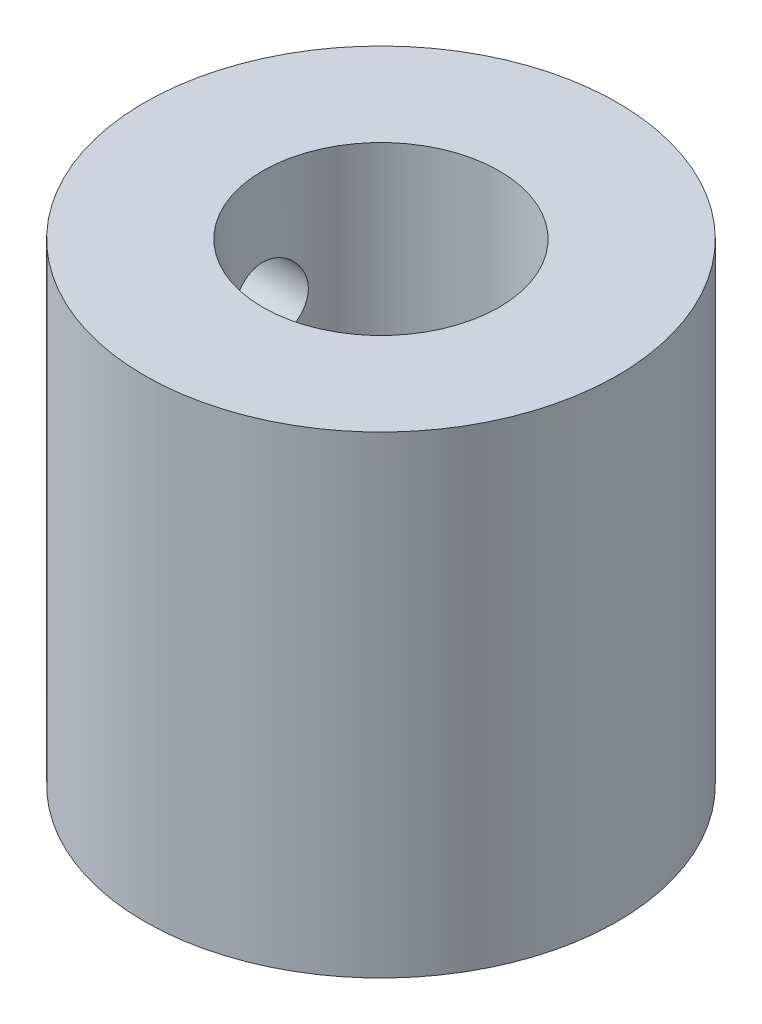
ISO-10303-21;
HEADER;
FILE_DESCRIPTION(('STEP AP214'),'2;1');
FILE_NAME('part.step','',(''),(''),'','','');
FILE_SCHEMA(('AUTOMOTIVE_DESIGN { 1 0 10303 214 1 1 1 1 }'));
ENDSEC;
DATA;
#1=APPLICATION_CONTEXT('core data for automotive mechanical design processes');
#2=APPLICATION_PROTOCOL_DEFINITION('international standard','automotive_design',2000,#1);
#3=PRODUCT_CONTEXT('',#1,'mechanical');
#4=PRODUCT('Part','Part','',(#3));
#5=PRODUCT_RELATED_PRODUCT_CATEGORY('part','',(#4));
#6=PRODUCT_DEFINITION_FORMATION('','',#4);
#7=PRODUCT_DEFINITION_CONTEXT('part definition',#1,'design');
#8=PRODUCT_DEFINITION('design','',#6,#7);
#9=PRODUCT_DEFINITION_SHAPE('','',#8);
#10=(LENGTH_UNIT() NAMED_UNIT(*) SI_UNIT(.MILLI.,.METRE.));
#11=(NAMED_UNIT(*) PLANE_ANGLE_UNIT() SI_UNIT($,.RADIAN.));
#12=(NAMED_UNIT(*) SI_UNIT($,.STERADIAN.) SOLID_ANGLE_UNIT());
#13=UNCERTAINTY_MEASURE_WITH_UNIT(LENGTH_MEASURE(1.E-05),#10,'distance_accuracy_value','');
#14=(GEOMETRIC_REPRESENTATION_CONTEXT(3) GLOBAL_UNCERTAINTY_ASSIGNED_CONTEXT((#13)) GLOBAL_UNIT_ASSIGNED_CONTEXT((#10,
#11,#12)) REPRESENTATION_CONTEXT('',''));
#15=CARTESIAN_POINT('',(0.,0.,0.));
#16=DIRECTION('',(0.,0.,1.));
#17=DIRECTION('',(1.,0.,0.));
#18=AXIS2_PLACEMENT_3D('',#15,#16,#17);
#19=CARTESIAN_POINT('',(0.,20.,0.));
#20=DIRECTION('',(0.,-1.,0.));
#21=DIRECTION('',(0.,0.,-1.));
#22=AXIS2_PLACEMENT_3D('',#19,#20,#21);
#23=CYLINDRICAL_SURFACE('',#22,4.);
#24=CARTESIAN_POINT('',(-3.64383040220041,5.,-1.65));
#25=CARTESIAN_POINT('',(-3.64383945275153,5.08809648022568,-1.64999056813102));
#26=CARTESIAN_POINT('',(-3.64707173267573,5.17634043197359,-1.64289989177358));
#27=CARTESIAN_POINT('',(-3.65959209124688,5.35028706107888,-1.61480845546373));
#28=CARTESIAN_POINT('',(-3.66889676295874,5.4359821005976,-1.5937695789634));
#29=CARTESIAN_POINT('',(-3.69231325052125,5.60200293813063,-1.53873536249638));
#30=CARTESIAN_POINT('',(-3.70640571161012,5.6823488202186,-1.50479212400174));
#31=CARTESIAN_POINT('',(-3.73778230052357,5.83618176683423,-1.42506535594207));
#32=CARTESIAN_POINT('',(-3.75506562873472,5.90967054278404,-1.37928479159595));
#33=CARTESIAN_POINT('',(-3.7920553041855,6.0522286878465,-1.27419856290372));
#34=CARTESIAN_POINT('',(-3.81184277704779,6.12082925578021,-1.2142851824136));
#35=CARTESIAN_POINT('',(-3.85094363418238,6.24735477190876,-1.08391072165483));
#36=CARTESIAN_POINT('',(-3.87025683535296,6.30527565147223,-1.01344563996365));
#37=CARTESIAN_POINT('',(-3.90721575035942,6.41117137130187,-0.860301943593384));
#38=CARTESIAN_POINT('',(-3.92475616703248,6.45862093270616,-0.777232390113593));
#39=CARTESIAN_POINT('',(-3.95520283117798,6.5386701453217,-0.603436361875859));
#40=CARTESIAN_POINT('',(-3.96811109652272,6.57127626434656,-0.512713242513047));
#41=CARTESIAN_POINT('',(-3.98726403378776,6.61902070665623,-0.3311051723044));
#42=CARTESIAN_POINT('',(-3.99381564337609,6.63496684792324,-0.240465625184494));
#43=CARTESIAN_POINT('',(-4.0006306156112,6.65154665185517,-0.0575763551498665));
#44=CARTESIAN_POINT('',(-4.00089647540932,6.65218639532201,0.0346727137709538));
#45=CARTESIAN_POINT('',(-3.99529224160632,6.63856350386341,0.212297380895984));
#46=CARTESIAN_POINT('',(-3.98978733384658,6.6251878162829,0.297754665400396));
#47=CARTESIAN_POINT('',(-3.97375926025944,6.58543118255225,0.465085845235278));
#48=CARTESIAN_POINT('',(-3.96323572489496,6.55904927870932,0.546959476205492));
#49=CARTESIAN_POINT('',(-3.93798907731603,6.49371233827982,0.706295606817229));
#50=CARTESIAN_POINT('',(-3.92320447216362,6.45457201007513,0.783671979762469));
#51=CARTESIAN_POINT('',(-3.89088763760773,6.3650087208134,0.930960489992466));
#52=CARTESIAN_POINT('',(-3.87335444442336,6.3145817994967,1.00086999453932));
#53=CARTESIAN_POINT('',(-3.83587133640027,6.19981176097137,1.13638530947041));
#54=CARTESIAN_POINT('',(-3.8158381454309,6.13474658910128,1.20135746318645));
#55=CARTESIAN_POINT('',(-3.77653142784555,5.99459033367843,1.31973838423493));
#56=CARTESIAN_POINT('',(-3.75725818494773,5.9194955507367,1.37314286572202));
#57=CARTESIAN_POINT('',(-3.72106607156909,5.75840159645269,1.46845339844828));
#58=CARTESIAN_POINT('',(-3.70424107982558,5.67213242830735,1.50994179309277));
#59=CARTESIAN_POINT('',(-3.67596385006485,5.49295332859411,1.57754508127096));
#60=CARTESIAN_POINT('',(-3.66450786071418,5.40004808612619,1.60367071206121));
#61=CARTESIAN_POINT('',(-3.64919091711418,5.21657710481502,1.63821320355941));
#62=CARTESIAN_POINT('',(-3.64489111171831,5.12624169881714,1.64765569454682));
#63=CARTESIAN_POINT('',(-3.64311980380967,4.9451943703014,1.65157101672826));
#64=CARTESIAN_POINT('',(-3.64564601607449,4.85448258394072,1.64604885780402));
#65=CARTESIAN_POINT('',(-3.65678944366161,4.68119899095053,1.62112710501826));
#66=CARTESIAN_POINT('',(-3.66501803861665,4.59847182032539,1.60261202118543));
#67=CARTESIAN_POINT('',(-3.68614612916707,4.43736293562003,1.55339580262015));
#68=CARTESIAN_POINT('',(-3.69904670212356,4.35898222864834,1.52269185697123));
#69=CARTESIAN_POINT('',(-3.72872477858182,4.20512099430436,1.44853902204985));
#70=CARTESIAN_POINT('',(-3.74564214050945,4.12989980522075,1.40460979308264));
#71=CARTESIAN_POINT('',(-3.78124523189864,3.98753983057027,1.30573455409451));
#72=CARTESIAN_POINT('',(-3.79993171387674,3.92040451226488,1.25078384473683));
#73=CARTESIAN_POINT('',(-3.83876011670653,3.79057037355329,1.12627542162098));
#74=CARTESIAN_POINT('',(-3.85889967217623,3.72864826295128,1.05590387126704));
#75=CARTESIAN_POINT('',(-3.89698114804694,3.61735714433793,0.905297980080104));
#76=CARTESIAN_POINT('',(-3.91492292631236,3.5679889479968,0.825063002026904));
#77=CARTESIAN_POINT('',(-3.94668767391886,3.48329586579321,0.656516816883267));
#78=CARTESIAN_POINT('',(-3.96050313975064,3.44799652499727,0.568191273870491));
#79=CARTESIAN_POINT('',(-3.98237104121022,3.39300834314125,0.386140833605177));
#80=CARTESIAN_POINT('',(-3.9904268305481,3.37331041706106,0.29241911281756));
#81=CARTESIAN_POINT('',(-3.9994889299446,3.35121177107952,0.109187189544835));
#82=CARTESIAN_POINT('',(-4.00094173424749,3.34771517125806,0.0198303081186347));
#83=CARTESIAN_POINT('',(-3.99786220239438,3.35518543437028,-0.158161739195413));
#84=CARTESIAN_POINT('',(-3.99333087896147,3.36614984999545,-0.246797024648481));
#85=CARTESIAN_POINT('',(-3.979024148364,3.40144464213556,-0.417705375935877));
#86=CARTESIAN_POINT('',(-3.96943363922013,3.42530444211455,-0.500092371627852));
#87=CARTESIAN_POINT('',(-3.94605480923816,3.48520411487999,-0.659667355734161));
#88=CARTESIAN_POINT('',(-3.93226568297162,3.52124632478668,-0.736854343148745));
#89=CARTESIAN_POINT('',(-3.90105808483759,3.60630452668639,-0.88766113373262));
#90=CARTESIAN_POINT('',(-3.88350423911689,3.65583125677293,-0.960964214361151));
#91=CARTESIAN_POINT('',(-3.84685709666619,3.76570284679,-1.09852932170705));
#92=CARTESIAN_POINT('',(-3.82776324400832,3.82605162308081,-1.1627880603165));
#93=CARTESIAN_POINT('',(-3.78859741195738,3.96058752735466,-1.28487769945047));
#94=CARTESIAN_POINT('',(-3.76854475207571,4.03542775688494,-1.34199767947157));
#95=CARTESIAN_POINT('',(-3.73105419200533,4.19426597568106,-1.4429647467733));
#96=CARTESIAN_POINT('',(-3.7136177396712,4.27826899170959,-1.48680449811904));
#97=CARTESIAN_POINT('',(-3.68370387904713,4.45272844126989,-1.55944447766652));
#98=CARTESIAN_POINT('',(-3.67119480418033,4.5431391080911,-1.58834112875234));
#99=CARTESIAN_POINT('',(-3.65281837075147,4.72804714407836,-1.63017263567573));
#100=CARTESIAN_POINT('',(-3.64692873900432,4.82252969087687,-1.64316103312975));
#101=CARTESIAN_POINT('',(-3.64414054419779,4.94486331364264,-1.6493120932942));
#102=CARTESIAN_POINT('',(-3.64382756923722,4.97242443228502,-1.6500029523216));
#103=CARTESIAN_POINT('',(-3.64383040220041,5.,-1.65));
#104=B_SPLINE_CURVE_WITH_KNOTS('',3,(#24,#25,#26,#27,#28,#29,#30,#31,#32,#33,#34,#35,#36,#37,
#38,#39,#40,#41,#42,#43,#44,#45,#46,#47,#48,#49,#50,#51,#52,#53,#54,#55,#56,#57,#58,#59,#60,#61,
#62,#63,#64,#65,#66,#67,#68,#69,#70,#71,#72,#73,#74,#75,#76,#77,#78,#79,#80,#81,#82,#83,#84,#85,
#86,#87,#88,#89,#90,#91,#92,#93,#94,#95,#96,#97,#98,#99,#100,#101,#102,#103),.UNSPECIFIED.,.T.,
.F.,(4,2,2,2,2,2,2,2,2,2,2,2,2,2,2,2,2,2,2,2,2,2,2,2,2,2,2,2,2,2,2,2,2,2,2,2,2,2,2,4),(0.,
0.264211724660745,0.529148459018598,0.79302667787205,1.05683885985756,1.33523297260792,
1.6137329267621,1.90403076094908,2.19420198072699,2.4695381624427,2.74476495901024,
3.00356896819766,3.26239203686791,3.5251552692474,3.78801084539546,4.06907613148065,
4.35024537535725,4.64031806272423,4.93018777241111,5.20152035698263,5.47276211576043,
5.72713321026166,5.98156300028881,6.24665916965709,6.51186861189124,6.79815687284347,
7.08446363898863,7.37128791456171,7.65794504349151,7.92489841526079,8.19180661499935,
8.44957452423759,8.70739191275388,8.97680852354695,9.24632283025307,9.53374725602176,
9.82133016535516,10.1070334851925,10.3917725616094,10.4744749384332),.UNSPECIFIED.);
#105=CARTESIAN_POINT('',(-3.64383040220041,5.,-1.65));
#106=VERTEX_POINT('',#105);
#107=EDGE_CURVE('E98',#106,#106,#104,.T.);
#108=ORIENTED_EDGE('',*,*,#107,.F.);
#109=EDGE_LOOP('',(#108));
#110=FACE_BOUND('',#109,.T.);
#111=CARTESIAN_POINT('',(0.,0.,0.));
#112=DIRECTION('',(0.,1.,0.));
#113=DIRECTION('',(0.,0.,1.));
#114=AXIS2_PLACEMENT_3D('',#111,#112,#113);
#115=CIRCLE('',#114,4.);
#116=CARTESIAN_POINT('',(0.,0.,4.));
#117=VERTEX_POINT('',#116);
#118=EDGE_CURVE('E61',#117,#117,#115,.T.);
#119=ORIENTED_EDGE('',*,*,#118,.F.);
#120=EDGE_LOOP('',(#119));
#121=FACE_BOUND('',#120,.T.);
#122=CARTESIAN_POINT('',(0.,10.,0.));
#123=DIRECTION('',(0.,1.,0.));
#124=DIRECTION('',(0.,0.,1.));
#125=AXIS2_PLACEMENT_3D('',#122,#123,#124);
#126=CIRCLE('',#125,4.);
#127=CARTESIAN_POINT('',(0.,10.,4.));
#128=VERTEX_POINT('',#127);
#129=EDGE_CURVE('E66',#128,#128,#126,.T.);
#130=ORIENTED_EDGE('',*,*,#129,.T.);
#131=EDGE_LOOP('',(#130));
#132=FACE_BOUND('',#131,.T.);
#133=ADVANCED_FACE('F37',(#110,#121,#132),#23,.F.);
#134=CARTESIAN_POINT('',(0.,20.,0.));
#135=DIRECTION('',(0.,1.,0.));
#136=DIRECTION('',(0.,0.,1.));
#137=AXIS2_PLACEMENT_3D('',#134,#135,#136);
#138=PLANE('',#137);
#139=CARTESIAN_POINT('',(0.,20.,0.));
#140=DIRECTION('',(0.,1.,0.));
#141=DIRECTION('',(0.,0.,1.));
#142=AXIS2_PLACEMENT_3D('',#139,#140,#141);
#143=CIRCLE('',#142,5.);
#144=CARTESIAN_POINT('',(0.,20.,5.));
#145=VERTEX_POINT('',#144);
#146=EDGE_CURVE('E105',#145,#145,#143,.T.);
#147=ORIENTED_EDGE('',*,*,#146,.F.);
#148=EDGE_LOOP('',(#147));
#149=FACE_BOUND('',#148,.T.);
#150=CARTESIAN_POINT('',(0.,20.,0.));
#151=DIRECTION('',(0.,1.,0.));
#152=DIRECTION('',(0.,0.,1.));
#153=AXIS2_PLACEMENT_3D('',#150,#151,#152);
#154=CIRCLE('',#153,10.);
#155=CARTESIAN_POINT('',(0.,20.,10.));
#156=VERTEX_POINT('',#155);
#157=EDGE_CURVE('E50',#156,#156,#154,.T.);
#158=ORIENTED_EDGE('',*,*,#157,.T.);
#159=EDGE_LOOP('',(#158));
#160=FACE_BOUND('',#159,.T.);
#161=ADVANCED_FACE('F109',(#149,#160),#138,.T.);
#162=CARTESIAN_POINT('',(0.,0.,0.));
#163=DIRECTION('',(0.,1.,0.));
#164=DIRECTION('',(0.,0.,1.));
#165=AXIS2_PLACEMENT_3D('',#162,#163,#164);
#166=PLANE('',#165);
#167=CARTESIAN_POINT('',(0.,0.,0.));
#168=DIRECTION('',(0.,1.,0.));
#169=DIRECTION('',(0.,0.,1.));
#170=AXIS2_PLACEMENT_3D('',#167,#168,#169);
#171=CIRCLE('',#170,10.);
#172=CARTESIAN_POINT('',(0.,0.,10.));
#173=VERTEX_POINT('',#172);
#174=EDGE_CURVE('E55',#173,#173,#171,.T.);
#175=ORIENTED_EDGE('',*,*,#174,.F.);
#176=EDGE_LOOP('',(#175));
#177=FACE_BOUND('',#176,.T.);
#178=ORIENTED_EDGE('',*,*,#118,.T.);
#179=EDGE_LOOP('',(#178));
#180=FACE_BOUND('',#179,.T.);
#181=ADVANCED_FACE('F112',(#177,#180),#166,.F.);
#182=CARTESIAN_POINT('',(0.,20.,0.));
#183=DIRECTION('',(0.,-1.,0.));
#184=DIRECTION('',(0.,0.,-1.));
#185=AXIS2_PLACEMENT_3D('',#182,#183,#184);
#186=CYLINDRICAL_SURFACE('',#185,10.);
#187=CARTESIAN_POINT('',(-10.,3.35,0.));
#188=CARTESIAN_POINT('',(-9.99999843258099,3.35000370098531,-0.0920114531057516));
#189=CARTESIAN_POINT('',(-9.99871684765511,3.35772245868542,-0.184073454347173));
#190=CARTESIAN_POINT('',(-9.99372775496381,3.38838123513793,-0.36561632253533));
#191=CARTESIAN_POINT('',(-9.99001800272159,3.4113353369588,-0.45509472135177));
#192=CARTESIAN_POINT('',(-9.98058875631552,3.47175363893591,-0.628817487751616));
#193=CARTESIAN_POINT('',(-9.974870893487,3.5092060635603,-0.713066038744487));
#194=CARTESIAN_POINT('',(-9.96205444853338,3.59752725414862,-0.874072236504044));
#195=CARTESIAN_POINT('',(-9.95495602786423,3.64839445150501,-0.950830757653331));
#196=CARTESIAN_POINT('',(-9.9400912001718,3.76260877713292,-1.09540879372213));
#197=CARTESIAN_POINT('',(-9.93231968689365,3.82605706361825,-1.1631478788234));
#198=CARTESIAN_POINT('',(-9.91702374723339,3.96341477359322,-1.28706950777735));
#199=CARTESIAN_POINT('',(-9.90949933632427,4.03732485064318,-1.34325132909589));
#200=CARTESIAN_POINT('',(-9.89550007731641,4.19405934367668,-1.44278500045254));
#201=CARTESIAN_POINT('',(-9.88903182722124,4.27693479434388,-1.48605749570899));
#202=CARTESIAN_POINT('',(-9.87794796970923,4.44890262523649,-1.55803674048925));
#203=CARTESIAN_POINT('',(-9.87333223970889,4.53799459364928,-1.58674445381556));
#204=CARTESIAN_POINT('',(-9.86652679242373,4.71901458200099,-1.6285261950301));
#205=CARTESIAN_POINT('',(-9.86431555933323,4.81090975567876,-1.64173895927951));
#206=CARTESIAN_POINT('',(-9.86250435770823,4.99563736592343,-1.65258585530687));
#207=CARTESIAN_POINT('',(-9.86290420804218,5.08846973703063,-1.6502210677036));
#208=CARTESIAN_POINT('',(-9.86625034802632,5.27144727705671,-1.63009303176278));
#209=CARTESIAN_POINT('',(-9.86917088684506,5.36161011402737,-1.61248549472488));
#210=CARTESIAN_POINT('',(-9.87718903199043,5.5376840705334,-1.5626160736781));
#211=CARTESIAN_POINT('',(-9.88228671162733,5.62359504678828,-1.53035369619839));
#212=CARTESIAN_POINT('',(-9.89411264039674,5.78919352992442,-1.45193210975572));
#213=CARTESIAN_POINT('',(-9.90084846298694,5.86884978924069,-1.40570810605851));
#214=CARTESIAN_POINT('',(-9.9151864393107,6.01933432390775,-1.30072141548378));
#215=CARTESIAN_POINT('',(-9.92278866158316,6.09016189991229,-1.24195773629987));
#216=CARTESIAN_POINT('',(-9.93811607123993,6.22187997888267,-1.11271072676603));
#217=CARTESIAN_POINT('',(-9.94584163094155,6.28263939462996,-1.04209376928223));
#218=CARTESIAN_POINT('',(-9.96045987838133,6.39146602160627,-0.891597059898569));
#219=CARTESIAN_POINT('',(-9.9673525609492,6.43953315404709,-0.811717250503361));
#220=CARTESIAN_POINT('',(-9.97953794169528,6.52162215053432,-0.644840083170757));
#221=CARTESIAN_POINT('',(-9.98482933722619,6.55563258763802,-0.557837003156563));
#222=CARTESIAN_POINT('',(-9.99320544362233,6.60852191277534,-0.379246930002474));
#223=CARTESIAN_POINT('',(-9.99629033536768,6.62740204114479,-0.287660313260825));
#224=CARTESIAN_POINT('',(-9.99988156603306,6.64931746116117,-0.103632983819164));
#225=CARTESIAN_POINT('',(-10.0004171933872,6.65253273612154,-0.0112142564118387));
#226=CARTESIAN_POINT('',(-9.99892971175882,6.64350680131974,0.172841505554678));
#227=CARTESIAN_POINT('',(-9.99690669920295,6.63126617403953,0.264478569441161));
#228=CARTESIAN_POINT('',(-9.99054737820398,6.5918255972229,0.443814955541767));
#229=CARTESIAN_POINT('',(-9.98622483070292,6.56471460569165,0.531534371938299));
#230=CARTESIAN_POINT('',(-9.97574921956607,6.49639760744493,0.70118295929459));
#231=CARTESIAN_POINT('',(-9.96959605484327,6.45519082233832,0.783111810188987));
#232=CARTESIAN_POINT('',(-9.95606928426946,6.35943868050102,0.93963639887725));
#233=CARTESIAN_POINT('',(-9.94868555427359,6.3047807140829,1.01416235726447));
#234=CARTESIAN_POINT('',(-9.93354765732487,6.18383285093121,1.15304841333208));
#235=CARTESIAN_POINT('',(-9.92579346406183,6.11754212714571,1.21740778758216));
#236=CARTESIAN_POINT('',(-9.91069407401676,5.97440389367171,1.33479962911472));
#237=CARTESIAN_POINT('',(-9.90335382329475,5.89745612890119,1.38771058951943));
#238=CARTESIAN_POINT('',(-9.89000528724129,5.73565895293254,1.47985547415617));
#239=CARTESIAN_POINT('',(-9.88399696030451,5.6508097886681,1.51908982562647));
#240=CARTESIAN_POINT('',(-9.87402953570153,5.47596046759685,1.58258535747086));
#241=CARTESIAN_POINT('',(-9.87006212213643,5.38598290020333,1.60690737863649));
#242=CARTESIAN_POINT('',(-9.86460473721113,5.20314868821944,1.64007952798876));
#243=CARTESIAN_POINT('',(-9.86311455516768,5.11029228915184,1.64893097191818));
#244=CARTESIAN_POINT('',(-9.86278931217107,4.92554935869819,1.65087457438795));
#245=CARTESIAN_POINT('',(-9.86392203182987,4.83366483980789,1.64415796786954));
#246=CARTESIAN_POINT('',(-9.86864441177183,4.65235224813613,1.61556925478547));
#247=CARTESIAN_POINT('',(-9.87223406454433,4.56292416784641,1.59369719454886));
#248=CARTESIAN_POINT('',(-9.88145370519205,4.38913475756459,1.53549112071356));
#249=CARTESIAN_POINT('',(-9.88708141498759,4.30476789254903,1.49917324977366));
#250=CARTESIAN_POINT('',(-9.8997453323177,4.14329373313968,1.41312606218935));
#251=CARTESIAN_POINT('',(-9.90678160742252,4.06618678727227,1.36339610211421));
#252=CARTESIAN_POINT('',(-9.92157214136343,3.92045450236231,1.25125259966706));
#253=CARTESIAN_POINT('',(-9.92933379899765,3.85193824018043,1.18869826623127));
#254=CARTESIAN_POINT('',(-9.94464125601211,3.72630940012324,1.05297867490409));
#255=CARTESIAN_POINT('',(-9.95218700513286,3.66919945921976,0.979810970092672));
#256=CARTESIAN_POINT('',(-9.96627143049842,3.56765257742652,0.824354696103047));
#257=CARTESIAN_POINT('',(-9.97280295936929,3.52330385202197,0.742007852048188));
#258=CARTESIAN_POINT('',(-9.98405342047581,3.44913664719369,0.570959586923796));
#259=CARTESIAN_POINT('',(-9.98877416450827,3.41930363587476,0.482264623543764));
#260=CARTESIAN_POINT('',(-9.99483601455804,3.38152065847315,0.327682758240929));
#261=CARTESIAN_POINT('',(-9.99676220083327,3.3697192511855,0.2627330667111));
#262=CARTESIAN_POINT('',(-9.99934474465587,3.35395766106689,0.131864227625941));
#263=CARTESIAN_POINT('',(-10.0000011233775,3.34999734748421,0.065945096254669));
#264=CARTESIAN_POINT('',(-10.,3.35,0.));
#265=B_SPLINE_CURVE_WITH_KNOTS('',3,(#187,#188,#189,#190,#191,#192,#193,#194,#195,#196,#197,
#198,#199,#200,#201,#202,#203,#204,#205,#206,#207,#208,#209,#210,#211,#212,#213,#214,#215,#216,
#217,#218,#219,#220,#221,#222,#223,#224,#225,#226,#227,#228,#229,#230,#231,#232,#233,#234,#235,
#236,#237,#238,#239,#240,#241,#242,#243,#244,#245,#246,#247,#248,#249,#250,#251,#252,#253,#254,
#255,#256,#257,#258,#259,#260,#261,#262,#263,#264),.UNSPECIFIED.,.T.,.F.,(4,2,2,2,2,2,2,2,2,2,2,
2,2,2,2,2,2,2,2,2,2,2,2,2,2,2,2,2,2,2,2,2,2,2,2,2,2,2,4),(0.,0.275793319008919,
0.551841928312974,0.827666799870601,1.10345943314171,1.38156673144316,1.65969141110742,
1.93949209608634,2.21927426326045,2.49653175525207,2.7737700140227,3.04820914252878,
3.32265751287873,3.59839967320043,3.87416366201708,4.15327572401922,4.43238951858749,
4.71172976565334,4.99104711092803,5.26714751096619,5.54323750600192,5.81769359979006,
6.09216485190806,6.36901711215388,6.6458890636926,6.92556925596461,7.2052407106323,
7.48376340648036,7.76226241335699,8.03735855216248,8.31245385002405,8.58724259883662,
8.8620445326932,9.14004258759621,9.41810483731135,9.69804546871321,9.97770526783285,
10.1753710978728,10.3730336317699),.UNSPECIFIED.);
#266=CARTESIAN_POINT('',(-10.,3.35,0.));
#267=VERTEX_POINT('',#266);
#268=EDGE_CURVE('E10',#267,#267,#265,.T.);
#269=ORIENTED_EDGE('',*,*,#268,.T.);
#270=EDGE_LOOP('',(#269));
#271=FACE_BOUND('',#270,.T.);
#272=CARTESIAN_POINT('',(-10.,13.35,0.));
#273=CARTESIAN_POINT('',(-9.99999843258099,13.3500037009853,-0.0920114531057514));
#274=CARTESIAN_POINT('',(-9.99871684765511,13.3577224586854,-0.184073454347173));
#275=CARTESIAN_POINT('',(-9.99372775496381,13.3883812351379,-0.36561632253533));
#276=CARTESIAN_POINT('',(-9.99001800272159,13.4113353369588,-0.45509472135177));
#277=CARTESIAN_POINT('',(-9.98058875631552,13.4717536389359,-0.628817487751616));
#278=CARTESIAN_POINT('',(-9.974870893487,13.5092060635603,-0.713066038744486));
#279=CARTESIAN_POINT('',(-9.96205444853338,13.5975272541486,-0.874072236504043));
#280=CARTESIAN_POINT('',(-9.95495602786423,13.648394451505,-0.95083075765333));
#281=CARTESIAN_POINT('',(-9.9400912001718,13.7626087771329,-1.09540879372213));
#282=CARTESIAN_POINT('',(-9.93231968689365,13.8260570636182,-1.16314787882339));
#283=CARTESIAN_POINT('',(-9.91702374723339,13.9634147735932,-1.28706950777735));
#284=CARTESIAN_POINT('',(-9.90949933632427,14.0373248506432,-1.34325132909589));
#285=CARTESIAN_POINT('',(-9.89550007731641,14.1940593436767,-1.44278500045254));
#286=CARTESIAN_POINT('',(-9.88903182722124,14.2769347943439,-1.48605749570899));
#287=CARTESIAN_POINT('',(-9.87794796970923,14.4489026252365,-1.55803674048925));
#288=CARTESIAN_POINT('',(-9.87333223970889,14.5379945936493,-1.58674445381556));
#289=CARTESIAN_POINT('',(-9.86652679242373,14.719014582001,-1.6285261950301));
#290=CARTESIAN_POINT('',(-9.86431555933323,14.8109097556788,-1.64173895927951));
#291=CARTESIAN_POINT('',(-9.86250435770823,14.9956373659234,-1.65258585530687));
#292=CARTESIAN_POINT('',(-9.86290420804218,15.0884697370306,-1.6502210677036));
#293=CARTESIAN_POINT('',(-9.86625034802632,15.2714472770567,-1.63009303176278));
#294=CARTESIAN_POINT('',(-9.86917088684506,15.3616101140274,-1.61248549472488));
#295=CARTESIAN_POINT('',(-9.87718903199043,15.5376840705334,-1.5626160736781));
#296=CARTESIAN_POINT('',(-9.88228671162733,15.6235950467883,-1.53035369619838));
#297=CARTESIAN_POINT('',(-9.89411264039674,15.7891935299244,-1.45193210975571));
#298=CARTESIAN_POINT('',(-9.90084846298694,15.8688497892407,-1.4057081060585));
#299=CARTESIAN_POINT('',(-9.9151864393107,16.0193343239078,-1.30072141548378));
#300=CARTESIAN_POINT('',(-9.92278866158316,16.0901618999123,-1.24195773629987));
#301=CARTESIAN_POINT('',(-9.93811607123993,16.2218799788827,-1.11271072676603));
#302=CARTESIAN_POINT('',(-9.94584163094155,16.28263939463,-1.04209376928223));
#303=CARTESIAN_POINT('',(-9.96045987838133,16.3914660216063,-0.891597059898569));
#304=CARTESIAN_POINT('',(-9.9673525609492,16.4395331540471,-0.811717250503361));
#305=CARTESIAN_POINT('',(-9.97953794169528,16.5216221505343,-0.644840083170756));
#306=CARTESIAN_POINT('',(-9.98482933722619,16.555632587638,-0.557837003156562));
#307=CARTESIAN_POINT('',(-9.99320544362233,16.6085219127753,-0.379246930002473));
#308=CARTESIAN_POINT('',(-9.99629033536768,16.6274020411448,-0.287660313260824));
#309=CARTESIAN_POINT('',(-9.99988156603306,16.6493174611612,-0.103632983819163));
#310=CARTESIAN_POINT('',(-10.0004171933872,16.6525327361215,-0.0112142564118374));
#311=CARTESIAN_POINT('',(-9.99892971175882,16.6435068013197,0.17284150555468));
#312=CARTESIAN_POINT('',(-9.99690669920295,16.6312661740395,0.264478569441163));
#313=CARTESIAN_POINT('',(-9.99054737820398,16.5918255972229,0.443814955541769));
#314=CARTESIAN_POINT('',(-9.98622483070291,16.5647146056916,0.531534371938301));
#315=CARTESIAN_POINT('',(-9.97574921956607,16.4963976074449,0.701182959294593));
#316=CARTESIAN_POINT('',(-9.96959605484327,16.4551908223383,0.78311181018899));
#317=CARTESIAN_POINT('',(-9.95606928426946,16.359438680501,0.939636398877252));
#318=CARTESIAN_POINT('',(-9.94868555427359,16.3047807140829,1.01416235726447));
#319=CARTESIAN_POINT('',(-9.93354765732487,16.1838328509312,1.15304841333209));
#320=CARTESIAN_POINT('',(-9.92579346406183,16.1175421271457,1.21740778758216));
#321=CARTESIAN_POINT('',(-9.91069407401676,15.9744038936717,1.33479962911472));
#322=CARTESIAN_POINT('',(-9.90335382329475,15.8974561289012,1.38771058951943));
#323=CARTESIAN_POINT('',(-9.89000528724129,15.7356589529325,1.47985547415617));
#324=CARTESIAN_POINT('',(-9.88399696030451,15.6508097886681,1.51908982562647));
#325=CARTESIAN_POINT('',(-9.87402953570153,15.4759604675969,1.58258535747086));
#326=CARTESIAN_POINT('',(-9.87006212213643,15.3859829002033,1.60690737863649));
#327=CARTESIAN_POINT('',(-9.86460473721113,15.2031486882194,1.64007952798876));
#328=CARTESIAN_POINT('',(-9.86311455516768,15.1102922891518,1.64893097191818));
#329=CARTESIAN_POINT('',(-9.86278931217107,14.9255493586982,1.65087457438795));
#330=CARTESIAN_POINT('',(-9.86392203182987,14.8336648398079,1.64415796786954));
#331=CARTESIAN_POINT('',(-9.86864441177183,14.6523522481361,1.61556925478547));
#332=CARTESIAN_POINT('',(-9.87223406454433,14.5629241678464,1.59369719454886));
#333=CARTESIAN_POINT('',(-9.88145370519205,14.3891347575646,1.53549112071357));
#334=CARTESIAN_POINT('',(-9.88708141498759,14.304767892549,1.49917324977366));
#335=CARTESIAN_POINT('',(-9.8997453323177,14.1432937331397,1.41312606218935));
#336=CARTESIAN_POINT('',(-9.90678160742252,14.0661867872723,1.36339610211421));
#337=CARTESIAN_POINT('',(-9.92157214136343,13.9204545023623,1.25125259966706));
#338=CARTESIAN_POINT('',(-9.92933379899765,13.8519382401804,1.18869826623127));
#339=CARTESIAN_POINT('',(-9.94464125601211,13.7263094001232,1.05297867490409));
#340=CARTESIAN_POINT('',(-9.95218700513286,13.6691994592198,0.979810970092673));
#341=CARTESIAN_POINT('',(-9.96627143049842,13.5676525774265,0.824354696103048));
#342=CARTESIAN_POINT('',(-9.97280295936929,13.523303852022,0.742007852048189));
#343=CARTESIAN_POINT('',(-9.98405342047581,13.4491366471937,0.570959586923797));
#344=CARTESIAN_POINT('',(-9.98877416450827,13.4193036358748,0.482264623543765));
#345=CARTESIAN_POINT('',(-9.99483601455804,13.3815206584732,0.32768275824093));
#346=CARTESIAN_POINT('',(-9.99676220083327,13.3697192511855,0.262733066711102));
#347=CARTESIAN_POINT('',(-9.99934474465587,13.3539576610669,0.131864227625942));
#348=CARTESIAN_POINT('',(-10.0000011233775,13.3499973474842,0.0659450962546694));
#349=CARTESIAN_POINT('',(-10.,13.35,0.));
#350=B_SPLINE_CURVE_WITH_KNOTS('',3,(#272,#273,#274,#275,#276,#277,#278,#279,#280,#281,#282,
#283,#284,#285,#286,#287,#288,#289,#290,#291,#292,#293,#294,#295,#296,#297,#298,#299,#300,#301,
#302,#303,#304,#305,#306,#307,#308,#309,#310,#311,#312,#313,#314,#315,#316,#317,#318,#319,#320,
#321,#322,#323,#324,#325,#326,#327,#328,#329,#330,#331,#332,#333,#334,#335,#336,#337,#338,#339,
#340,#341,#342,#343,#344,#345,#346,#347,#348,#349),.UNSPECIFIED.,.T.,.F.,(4,2,2,2,2,2,2,2,2,2,2,
2,2,2,2,2,2,2,2,2,2,2,2,2,2,2,2,2,2,2,2,2,2,2,2,2,2,2,4),(0.,0.275793319008919,
0.551841928312974,0.8276667998706,1.10345943314171,1.38156673144316,1.65969141110742,
1.93949209608634,2.21927426326045,2.49653175525207,2.7737700140227,3.04820914252878,
3.32265751287873,3.59839967320044,3.87416366201708,4.15327572401922,4.43238951858749,
4.71172976565334,4.99104711092802,5.26714751096619,5.54323750600191,5.81769359979006,
6.09216485190805,6.36901711215388,6.6458890636926,6.92556925596461,7.2052407106323,
7.48376340648035,7.76226241335699,8.03735855216248,8.31245385002405,8.58724259883662,
8.86204453269319,9.1400425875962,9.41810483731135,9.69804546871321,9.97770526783285,
10.1753710978728,10.3730336317699),.UNSPECIFIED.);
#351=CARTESIAN_POINT('',(-10.,13.35,0.));
#352=VERTEX_POINT('',#351);
#353=EDGE_CURVE('E78',#352,#352,#350,.T.);
#354=ORIENTED_EDGE('',*,*,#353,.T.);
#355=EDGE_LOOP('',(#354));
#356=FACE_BOUND('',#355,.T.);
#357=ORIENTED_EDGE('',*,*,#157,.F.);
#358=EDGE_LOOP('',(#357));
#359=FACE_BOUND('',#358,.T.);
#360=ORIENTED_EDGE('',*,*,#174,.T.);
#361=EDGE_LOOP('',(#360));
#362=FACE_BOUND('',#361,.T.);
#363=ADVANCED_FACE('F39',(#271,#356,#359,#362),#186,.T.);
#364=CARTESIAN_POINT('',(0.,10.,0.));
#365=DIRECTION('',(0.,1.,0.));
#366=DIRECTION('',(0.,0.,1.));
#367=AXIS2_PLACEMENT_3D('',#364,#365,#366);
#368=CYLINDRICAL_SURFACE('',#367,5.);
#369=CARTESIAN_POINT('',(-4.71990466005406,15.,-1.65));
#370=CARTESIAN_POINT('',(-4.71990452115883,14.9100706007094,-1.65000024360504));
#371=CARTESIAN_POINT('',(-4.72250292266519,14.8201423135003,-1.64262303818655));
#372=CARTESIAN_POINT('',(-4.73256311651638,14.6429463265648,-1.61340616817484));
#373=CARTESIAN_POINT('',(-4.74002579119602,14.5556791125396,-1.5915638797359));
#374=CARTESIAN_POINT('',(-4.75887919770346,14.3864003006209,-1.53426465819808));
#375=CARTESIAN_POINT('',(-4.77026235105614,14.3043789223365,-1.49883397722407));
#376=CARTESIAN_POINT('',(-4.79566317693293,14.1474185036429,-1.41545303535855));
#377=CARTESIAN_POINT('',(-4.80968141232602,14.0724809815363,-1.36750009878647));
#378=CARTESIAN_POINT('',(-4.83937566103107,13.9289423606118,-1.25846654308765));
#379=CARTESIAN_POINT('',(-4.85509238793419,13.8606525142665,-1.1969871597991));
#380=CARTESIAN_POINT('',(-4.88606822622471,13.7351407323211,-1.06349727663172));
#381=CARTESIAN_POINT('',(-4.90132726544298,13.677920534534,-0.991485126335477));
#382=CARTESIAN_POINT('',(-4.93013890958224,13.5747664109772,-0.8367042156024));
#383=CARTESIAN_POINT('',(-4.94363804307574,13.5291576935933,-0.753707887278363));
#384=CARTESIAN_POINT('',(-4.9669298740668,13.4526712651502,-0.580699685040885));
#385=CARTESIAN_POINT('',(-4.97672354920831,13.4217896679435,-0.490689669179504));
#386=CARTESIAN_POINT('',(-4.99121262924257,13.3766869281248,-0.309471831071058));
#387=CARTESIAN_POINT('',(-4.99607073696453,13.3619327850115,-0.218409916306844));
#388=CARTESIAN_POINT('',(-5.00071837425094,13.3478100012852,-0.0349820134684148));
#389=CARTESIAN_POINT('',(-5.00050918484354,13.3484374721539,0.0573836391159489));
#390=CARTESIAN_POINT('',(-4.99515654976729,13.3647199745431,0.237027933093927));
#391=CARTESIAN_POINT('',(-4.99020313675408,13.3797962649372,0.324365615952691));
#392=CARTESIAN_POINT('',(-4.9761564157389,13.4235926031857,0.495193577669013));
#393=CARTESIAN_POINT('',(-4.96706282865059,13.4523135708243,0.578683596740285));
#394=CARTESIAN_POINT('',(-4.94551338736031,13.5229273780642,0.740723104693065));
#395=CARTESIAN_POINT('',(-4.93301533884174,13.5649866842574,0.819194207586599));
#396=CARTESIAN_POINT('',(-4.90596050876768,13.6609466750387,0.968137400016382));
#397=CARTESIAN_POINT('',(-4.89140316323876,13.7148506057233,1.03860728872218));
#398=CARTESIAN_POINT('',(-4.86097294536879,13.8358951764672,1.1729917525873));
#399=CARTESIAN_POINT('',(-4.84507036749807,13.9035323057344,1.23645304594368));
#400=CARTESIAN_POINT('',(-4.81431124792123,14.0486265896356,1.35127700383062));
#401=CARTESIAN_POINT('',(-4.79945486104327,14.1260851930411,1.4026378802203));
#402=CARTESIAN_POINT('',(-4.77230967313122,14.2900343988576,1.49241382326108));
#403=CARTESIAN_POINT('',(-4.76005891661914,14.3766343876614,1.5306415054313));
#404=CARTESIAN_POINT('',(-4.73995346804782,14.5555476071575,1.59181981773764));
#405=CARTESIAN_POINT('',(-4.73209697762928,14.6478584834583,1.61477669819906));
#406=CARTESIAN_POINT('',(-4.72207527963097,14.8311901676993,1.64384682592321));
#407=CARTESIAN_POINT('',(-4.71967327795615,14.9220868443492,1.6506614560171));
#408=CARTESIAN_POINT('',(-4.7201713665852,15.1037378478879,1.64923749492087));
#409=CARTESIAN_POINT('',(-4.72307051828914,15.1944921971292,1.64100156851918));
#410=CARTESIAN_POINT('',(-4.73360855675225,15.3701200722367,1.61033997123775));
#411=CARTESIAN_POINT('',(-4.74108573426459,15.4550887693968,1.58839792719591));
#412=CARTESIAN_POINT('',(-4.75976051805482,15.6201226070167,1.53152522846697));
#413=CARTESIAN_POINT('',(-4.77095877549974,15.7001868863261,1.49659230032422));
#414=CARTESIAN_POINT('',(-4.79624726899171,15.8559100270408,1.41348842564755));
#415=CARTESIAN_POINT('',(-4.81041691149476,15.9313531690256,1.36493806698655));
#416=CARTESIAN_POINT('',(-4.83989585604412,16.0732756037467,1.25640957990473));
#417=CARTESIAN_POINT('',(-4.85520548680903,16.1397522953269,1.19642814746825));
#418=CARTESIAN_POINT('',(-4.88610989384612,16.2650831807835,1.06339123842035));
#419=CARTESIAN_POINT('',(-4.90168425037641,16.3234322389265,0.989853763923049));
#420=CARTESIAN_POINT('',(-4.93065204495412,16.4269926415911,0.833649177353404));
#421=CARTESIAN_POINT('',(-4.94404556482344,16.4722044790525,0.750982407994641));
#422=CARTESIAN_POINT('',(-4.96707750850083,16.5477889922588,0.579295715379798));
#423=CARTESIAN_POINT('',(-4.976740841375,16.5782604587435,0.490322802958603));
#424=CARTESIAN_POINT('',(-4.99133146825929,16.6236866931923,0.308134735858254));
#425=CARTESIAN_POINT('',(-4.99626043401974,16.6386469384652,0.214921090808602));
#426=CARTESIAN_POINT('',(-5.00070328980923,16.6521408178569,0.0315225864698985));
#427=CARTESIAN_POINT('',(-5.00045646732494,16.6514003120892,-0.0586036580668717));
#428=CARTESIAN_POINT('',(-4.99516201889143,16.6352984757264,-0.237388028290533));
#429=CARTESIAN_POINT('',(-4.99011476942583,16.6199382917103,-0.326046268553992));
#430=CARTESIAN_POINT('',(-4.97587240449466,16.5755116940758,-0.498029665785519));
#431=CARTESIAN_POINT('',(-4.96674195827476,16.5466586650808,-0.58141568037716));
#432=CARTESIAN_POINT('',(-4.94527347683187,16.4762621052186,-0.742196807428923));
#433=CARTESIAN_POINT('',(-4.93293486552038,16.4347162948805,-0.81959084066955));
#434=CARTESIAN_POINT('',(-4.90576374946711,16.3383673460749,-0.969268380933023));
#435=CARTESIAN_POINT('',(-4.89085668492739,16.2831358519031,-1.04126244269286));
#436=CARTESIAN_POINT('',(-4.86041514438607,16.1617163493559,-1.17519818555166));
#437=CARTESIAN_POINT('',(-4.84488047141097,16.0955248807022,-1.23713667964079));
#438=CARTESIAN_POINT('',(-4.81423121094682,15.9510441485454,-1.35160179814247));
#439=CARTESIAN_POINT('',(-4.79915525016868,15.8723897305108,-1.40367929286429));
#440=CARTESIAN_POINT('',(-4.77186368687929,15.7069783378758,-1.49383628223878));
#441=CARTESIAN_POINT('',(-4.759647267495,15.6202236871651,-1.53191977627391));
#442=CARTESIAN_POINT('',(-4.74014636717988,15.4456567275568,-1.59120734764472));
#443=CARTESIAN_POINT('',(-4.7326392026776,15.3581319580648,-1.61318355190478));
#444=CARTESIAN_POINT('',(-4.72251921935149,15.1804038287073,-1.64257737451179));
#445=CARTESIAN_POINT('',(-4.71990479936932,15.0902013549447,-1.64999975565828));
#446=CARTESIAN_POINT('',(-4.71990466005406,15.,-1.65));
#447=B_SPLINE_CURVE_WITH_KNOTS('',3,(#369,#370,#371,#372,#373,#374,#375,#376,#377,#378,#379,
#380,#381,#382,#383,#384,#385,#386,#387,#388,#389,#390,#391,#392,#393,#394,#395,#396,#397,#398,
#399,#400,#401,#402,#403,#404,#405,#406,#407,#408,#409,#410,#411,#412,#413,#414,#415,#416,#417,
#418,#419,#420,#421,#422,#423,#424,#425,#426,#427,#428,#429,#430,#431,#432,#433,#434,#435,#436,
#437,#438,#439,#440,#441,#442,#443,#444,#445,#446),.UNSPECIFIED.,.T.,.F.,(4,2,2,2,2,2,2,2,2,2,2,
2,2,2,2,2,2,2,2,2,2,2,2,2,2,2,2,2,2,2,2,2,2,2,2,2,2,2,4),(0.,0.269454302916434,
0.538957495994026,0.80794262345763,1.07698527314817,1.3553904348317,1.63383926765626,
1.91939248597708,2.2048703116341,2.48059787689522,2.75625573811558,3.02131448573184,
3.2863911034247,3.55491555402299,3.82351368748604,4.10452131305698,4.38557043856029,
4.67047751353535,4.95526790443248,5.22743703243199,5.49955797597573,5.76258081799808,
6.02564971172707,6.29693565916084,6.56830013781586,6.85241935986189,7.13652791970021,
7.41870503995781,7.70078248410448,7.96984890311456,8.23889422176276,8.5038215595789,
8.76879650315116,9.04343817678385,9.31816672608184,9.60337461850677,9.88850093710114,
10.1588585876967,10.4291277478431),.UNSPECIFIED.);
#448=CARTESIAN_POINT('',(-4.71990466005406,15.,-1.65));
#449=VERTEX_POINT('',#448);
#450=EDGE_CURVE('E70',#449,#449,#447,.T.);
#451=ORIENTED_EDGE('',*,*,#450,.T.);
#452=EDGE_LOOP('',(#451));
#453=FACE_BOUND('',#452,.T.);
#454=CARTESIAN_POINT('',(0.,10.,0.));
#455=DIRECTION('',(0.,1.,0.));
#456=DIRECTION('',(0.,0.,1.));
#457=AXIS2_PLACEMENT_3D('',#454,#455,#456);
#458=CIRCLE('',#457,5.);
#459=CARTESIAN_POINT('',(0.,10.,5.));
#460=VERTEX_POINT('',#459);
#461=EDGE_CURVE('E69',#460,#460,#458,.T.);
#462=ORIENTED_EDGE('',*,*,#461,.F.);
#463=EDGE_LOOP('',(#462));
#464=FACE_BOUND('',#463,.T.);
#465=ORIENTED_EDGE('',*,*,#146,.T.);
#466=EDGE_LOOP('',(#465));
#467=FACE_BOUND('',#466,.T.);
#468=ADVANCED_FACE('F79',(#453,#464,#467),#368,.F.);
#469=CARTESIAN_POINT('',(0.,10.,0.));
#470=DIRECTION('',(0.,1.,0.));
#471=DIRECTION('',(0.,0.,1.));
#472=AXIS2_PLACEMENT_3D('',#469,#470,#471);
#473=PLANE('',#472);
#474=ORIENTED_EDGE('',*,*,#129,.F.);
#475=EDGE_LOOP('',(#474));
#476=FACE_BOUND('',#475,.T.);
#477=ORIENTED_EDGE('',*,*,#461,.T.);
#478=EDGE_LOOP('',(#477));
#479=FACE_BOUND('',#478,.T.);
#480=ADVANCED_FACE('F87',(#476,#479),#473,.T.);
#481=CARTESIAN_POINT('',(-10.,15.,0.));
#482=DIRECTION('',(1.,0.,0.));
#483=DIRECTION('',(0.,0.,-1.));
#484=AXIS2_PLACEMENT_3D('',#481,#482,#483);
#485=CYLINDRICAL_SURFACE('',#484,1.65);
#486=ORIENTED_EDGE('',*,*,#450,.F.);
#487=EDGE_LOOP('',(#486));
#488=FACE_BOUND('',#487,.T.);
#489=ORIENTED_EDGE('',*,*,#353,.F.);
#490=EDGE_LOOP('',(#489));
#491=FACE_BOUND('',#490,.T.);
#492=ADVANCED_FACE('F83',(#488,#491),#485,.F.);
#493=CARTESIAN_POINT('',(-10.,5.,0.));
#494=DIRECTION('',(1.,0.,0.));
#495=DIRECTION('',(0.,0.,-1.));
#496=AXIS2_PLACEMENT_3D('',#493,#494,#495);
#497=CYLINDRICAL_SURFACE('',#496,1.65);
#498=ORIENTED_EDGE('',*,*,#107,.T.);
#499=EDGE_LOOP('',(#498));
#500=FACE_BOUND('',#499,.T.);
#501=ORIENTED_EDGE('',*,*,#268,.F.);
#502=EDGE_LOOP('',(#501));
#503=FACE_BOUND('',#502,.T.);
#504=ADVANCED_FACE('F86',(#500,#503),#497,.F.);
#505=CLOSED_SHELL('',(#133,#161,#181,#363,#468,#480,#492,#504));
#506=MANIFOLD_SOLID_BREP('B2',#505);
#507=ADVANCED_BREP_SHAPE_REPRESENTATION('',(#18,#506),#14);
#508=SHAPE_DEFINITION_REPRESENTATION(#9,#507);
ENDSEC;
END-ISO-10303-21;
